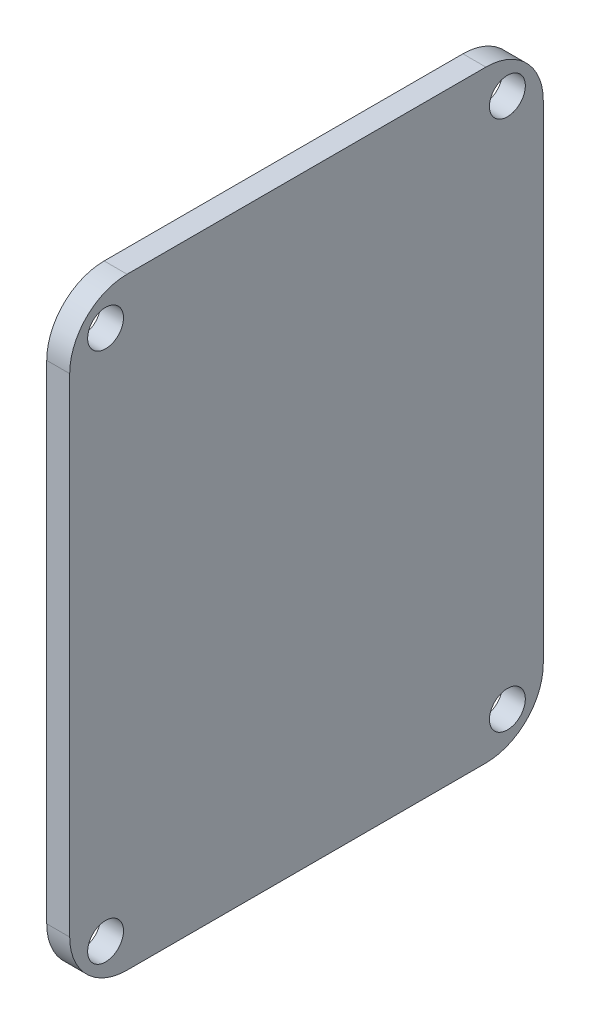
ISO-10303-21;
HEADER;
FILE_DESCRIPTION(('STEP AP214'),'2;1');
FILE_NAME('part.step','',(''),(''),'','','');
FILE_SCHEMA(('AUTOMOTIVE_DESIGN { 1 0 10303 214 1 1 1 1 }'));
ENDSEC;
DATA;
#1=APPLICATION_CONTEXT('core data for automotive mechanical design processes');
#2=APPLICATION_PROTOCOL_DEFINITION('international standard','automotive_design',2000,#1);
#3=PRODUCT_CONTEXT('',#1,'mechanical');
#4=PRODUCT('Part','Part','',(#3));
#5=PRODUCT_RELATED_PRODUCT_CATEGORY('part','',(#4));
#6=PRODUCT_DEFINITION_FORMATION('','',#4);
#7=PRODUCT_DEFINITION_CONTEXT('part definition',#1,'design');
#8=PRODUCT_DEFINITION('design','',#6,#7);
#9=PRODUCT_DEFINITION_SHAPE('','',#8);
#10=(LENGTH_UNIT() NAMED_UNIT(*) SI_UNIT(.MILLI.,.METRE.));
#11=(NAMED_UNIT(*) PLANE_ANGLE_UNIT() SI_UNIT($,.RADIAN.));
#12=(NAMED_UNIT(*) SI_UNIT($,.STERADIAN.) SOLID_ANGLE_UNIT());
#13=UNCERTAINTY_MEASURE_WITH_UNIT(LENGTH_MEASURE(1.E-05),#10,'distance_accuracy_value','');
#14=(GEOMETRIC_REPRESENTATION_CONTEXT(3) GLOBAL_UNCERTAINTY_ASSIGNED_CONTEXT((#13)) GLOBAL_UNIT_ASSIGNED_CONTEXT((#10,
#11,#12)) REPRESENTATION_CONTEXT('',''));
#15=CARTESIAN_POINT('',(0.,0.,0.));
#16=DIRECTION('',(0.,0.,1.));
#17=DIRECTION('',(1.,0.,0.));
#18=AXIS2_PLACEMENT_3D('',#15,#16,#17);
#19=CARTESIAN_POINT('',(1.6,-17.,-12.5));
#20=DIRECTION('',(-1.,0.,0.));
#21=DIRECTION('',(0.,0.,1.));
#22=AXIS2_PLACEMENT_3D('',#19,#20,#21);
#23=PLANE('',#22);
#24=CARTESIAN_POINT('',(1.6,-17.,-12.5));
#25=DIRECTION('',(1.,0.,0.));
#26=DIRECTION('',(0.,0.,1.));
#27=AXIS2_PLACEMENT_3D('',#24,#25,#26);
#28=CIRCLE('',#27,4.);
#29=CARTESIAN_POINT('',(1.6,-21.,-12.5));
#30=VERTEX_POINT('',#29);
#31=CARTESIAN_POINT('',(1.6,-17.,-16.5));
#32=VERTEX_POINT('',#31);
#33=EDGE_CURVE('E170',#30,#32,#28,.T.);
#34=ORIENTED_EDGE('',*,*,#33,.T.);
#35=DIRECTION('',(0.,1.,0.));
#36=VECTOR('',#35,1.);
#37=CARTESIAN_POINT('',(1.6,-17.,-16.5));
#38=LINE('',#37,#36);
#39=CARTESIAN_POINT('',(1.6,17.,-16.5));
#40=VERTEX_POINT('',#39);
#41=EDGE_CURVE('E106',#32,#40,#38,.T.);
#42=ORIENTED_EDGE('',*,*,#41,.T.);
#43=CARTESIAN_POINT('',(1.6,17.,-12.5));
#44=DIRECTION('',(1.,0.,0.));
#45=DIRECTION('',(0.,0.,-1.));
#46=AXIS2_PLACEMENT_3D('',#43,#44,#45);
#47=CIRCLE('',#46,4.);
#48=CARTESIAN_POINT('',(1.6,21.,-12.5));
#49=VERTEX_POINT('',#48);
#50=EDGE_CURVE('E191',#40,#49,#47,.T.);
#51=ORIENTED_EDGE('',*,*,#50,.T.);
#52=DIRECTION('',(0.,0.,1.));
#53=VECTOR('',#52,1.);
#54=CARTESIAN_POINT('',(1.6,21.,-12.5));
#55=LINE('',#54,#53);
#56=CARTESIAN_POINT('',(1.6,21.,12.5));
#57=VERTEX_POINT('',#56);
#58=EDGE_CURVE('E205',#49,#57,#55,.T.);
#59=ORIENTED_EDGE('',*,*,#58,.T.);
#60=CARTESIAN_POINT('',(1.6,17.,12.5));
#61=DIRECTION('',(1.,0.,0.));
#62=DIRECTION('',(0.,0.,1.));
#63=AXIS2_PLACEMENT_3D('',#60,#61,#62);
#64=CIRCLE('',#63,4.);
#65=CARTESIAN_POINT('',(1.6,17.,16.5));
#66=VERTEX_POINT('',#65);
#67=EDGE_CURVE('E125',#57,#66,#64,.T.);
#68=ORIENTED_EDGE('',*,*,#67,.T.);
#69=DIRECTION('',(0.,-1.,0.));
#70=VECTOR('',#69,1.);
#71=CARTESIAN_POINT('',(1.6,-17.,16.5));
#72=LINE('',#71,#70);
#73=CARTESIAN_POINT('',(1.6,-17.,16.5));
#74=VERTEX_POINT('',#73);
#75=EDGE_CURVE('E119',#66,#74,#72,.T.);
#76=ORIENTED_EDGE('',*,*,#75,.T.);
#77=CARTESIAN_POINT('',(1.6,-17.,12.5));
#78=DIRECTION('',(1.,0.,0.));
#79=DIRECTION('',(0.,0.,1.));
#80=AXIS2_PLACEMENT_3D('',#77,#78,#79);
#81=CIRCLE('',#80,4.);
#82=CARTESIAN_POINT('',(1.6,-21.,12.5));
#83=VERTEX_POINT('',#82);
#84=EDGE_CURVE('E123',#74,#83,#81,.T.);
#85=ORIENTED_EDGE('',*,*,#84,.T.);
#86=DIRECTION('',(0.,0.,-1.));
#87=VECTOR('',#86,1.);
#88=CARTESIAN_POINT('',(1.6,-21.,-12.5));
#89=LINE('',#88,#87);
#90=EDGE_CURVE('E63',#83,#30,#89,.T.);
#91=ORIENTED_EDGE('',*,*,#90,.T.);
#92=EDGE_LOOP('',(#34,#42,#51,#59,#68,#76,#85,#91));
#93=FACE_BOUND('',#92,.T.);
#94=CARTESIAN_POINT('',(1.6,-18.5,14.));
#95=DIRECTION('',(1.,0.,0.));
#96=DIRECTION('',(0.,0.,-1.));
#97=AXIS2_PLACEMENT_3D('',#94,#95,#96);
#98=CIRCLE('',#97,1.25);
#99=CARTESIAN_POINT('',(1.6,-18.5,12.75));
#100=VERTEX_POINT('',#99);
#101=EDGE_CURVE('E152',#100,#100,#98,.T.);
#102=ORIENTED_EDGE('',*,*,#101,.F.);
#103=EDGE_LOOP('',(#102));
#104=FACE_BOUND('',#103,.T.);
#105=CARTESIAN_POINT('',(1.6,18.5,14.));
#106=DIRECTION('',(1.,0.,0.));
#107=DIRECTION('',(0.,0.,-1.));
#108=AXIS2_PLACEMENT_3D('',#105,#106,#107);
#109=CIRCLE('',#108,1.25);
#110=CARTESIAN_POINT('',(1.6,18.5,12.75));
#111=VERTEX_POINT('',#110);
#112=EDGE_CURVE('E219',#111,#111,#109,.T.);
#113=ORIENTED_EDGE('',*,*,#112,.F.);
#114=EDGE_LOOP('',(#113));
#115=FACE_BOUND('',#114,.T.);
#116=CARTESIAN_POINT('',(1.6,-18.5,-14.));
#117=DIRECTION('',(1.,0.,0.));
#118=DIRECTION('',(0.,0.,-1.));
#119=AXIS2_PLACEMENT_3D('',#116,#117,#118);
#120=CIRCLE('',#119,1.25);
#121=CARTESIAN_POINT('',(1.6,-18.5,-15.25));
#122=VERTEX_POINT('',#121);
#123=EDGE_CURVE('E227',#122,#122,#120,.T.);
#124=ORIENTED_EDGE('',*,*,#123,.F.);
#125=EDGE_LOOP('',(#124));
#126=FACE_BOUND('',#125,.T.);
#127=CARTESIAN_POINT('',(1.6,18.5,-14.));
#128=DIRECTION('',(1.,0.,0.));
#129=DIRECTION('',(0.,0.,-1.));
#130=AXIS2_PLACEMENT_3D('',#127,#128,#129);
#131=CIRCLE('',#130,1.25);
#132=CARTESIAN_POINT('',(1.6,18.5,-15.25));
#133=VERTEX_POINT('',#132);
#134=EDGE_CURVE('E235',#133,#133,#131,.T.);
#135=ORIENTED_EDGE('',*,*,#134,.F.);
#136=EDGE_LOOP('',(#135));
#137=FACE_BOUND('',#136,.T.);
#138=ADVANCED_FACE('F45',(#93,#104,#115,#126,#137),#23,.F.);
#139=CARTESIAN_POINT('',(0.,-17.,-12.5));
#140=DIRECTION('',(-1.,0.,0.));
#141=DIRECTION('',(0.,0.,1.));
#142=AXIS2_PLACEMENT_3D('',#139,#140,#141);
#143=PLANE('',#142);
#144=CARTESIAN_POINT('',(0.,-18.5,-14.));
#145=DIRECTION('',(1.,0.,0.));
#146=DIRECTION('',(0.,0.,-1.));
#147=AXIS2_PLACEMENT_3D('',#144,#145,#146);
#148=CIRCLE('',#147,1.25);
#149=CARTESIAN_POINT('',(0.,-18.5,-15.25));
#150=VERTEX_POINT('',#149);
#151=EDGE_CURVE('E231',#150,#150,#148,.T.);
#152=ORIENTED_EDGE('',*,*,#151,.T.);
#153=EDGE_LOOP('',(#152));
#154=FACE_BOUND('',#153,.T.);
#155=CARTESIAN_POINT('',(0.,-18.5,14.));
#156=DIRECTION('',(1.,0.,0.));
#157=DIRECTION('',(0.,0.,-1.));
#158=AXIS2_PLACEMENT_3D('',#155,#156,#157);
#159=CIRCLE('',#158,1.25);
#160=CARTESIAN_POINT('',(0.,-18.5,12.75));
#161=VERTEX_POINT('',#160);
#162=EDGE_CURVE('E215',#161,#161,#159,.T.);
#163=ORIENTED_EDGE('',*,*,#162,.T.);
#164=EDGE_LOOP('',(#163));
#165=FACE_BOUND('',#164,.T.);
#166=CARTESIAN_POINT('',(0.,-17.,-12.5));
#167=DIRECTION('',(1.,0.,0.));
#168=DIRECTION('',(0.,0.,1.));
#169=AXIS2_PLACEMENT_3D('',#166,#167,#168);
#170=CIRCLE('',#169,4.);
#171=CARTESIAN_POINT('',(0.,-21.,-12.5));
#172=VERTEX_POINT('',#171);
#173=CARTESIAN_POINT('',(0.,-17.,-16.5));
#174=VERTEX_POINT('',#173);
#175=EDGE_CURVE('E147',#172,#174,#170,.T.);
#176=ORIENTED_EDGE('',*,*,#175,.F.);
#177=DIRECTION('',(0.,0.,-1.));
#178=VECTOR('',#177,1.);
#179=CARTESIAN_POINT('',(0.,-21.,-12.5));
#180=LINE('',#179,#178);
#181=CARTESIAN_POINT('',(0.,-21.,12.5));
#182=VERTEX_POINT('',#181);
#183=EDGE_CURVE('E98',#182,#172,#180,.T.);
#184=ORIENTED_EDGE('',*,*,#183,.F.);
#185=CARTESIAN_POINT('',(0.,-17.,12.5));
#186=DIRECTION('',(1.,0.,0.));
#187=DIRECTION('',(0.,0.,1.));
#188=AXIS2_PLACEMENT_3D('',#185,#186,#187);
#189=CIRCLE('',#188,4.);
#190=CARTESIAN_POINT('',(0.,-17.,16.5));
#191=VERTEX_POINT('',#190);
#192=EDGE_CURVE('E92',#191,#182,#189,.T.);
#193=ORIENTED_EDGE('',*,*,#192,.F.);
#194=DIRECTION('',(0.,-1.,0.));
#195=VECTOR('',#194,1.);
#196=CARTESIAN_POINT('',(0.,-17.,16.5));
#197=LINE('',#196,#195);
#198=CARTESIAN_POINT('',(0.,17.,16.5));
#199=VERTEX_POINT('',#198);
#200=EDGE_CURVE('E134',#199,#191,#197,.T.);
#201=ORIENTED_EDGE('',*,*,#200,.F.);
#202=CARTESIAN_POINT('',(0.,17.,12.5));
#203=DIRECTION('',(1.,0.,0.));
#204=DIRECTION('',(0.,0.,1.));
#205=AXIS2_PLACEMENT_3D('',#202,#203,#204);
#206=CIRCLE('',#205,4.);
#207=CARTESIAN_POINT('',(0.,21.,12.5));
#208=VERTEX_POINT('',#207);
#209=EDGE_CURVE('E161',#208,#199,#206,.T.);
#210=ORIENTED_EDGE('',*,*,#209,.F.);
#211=DIRECTION('',(0.,0.,1.));
#212=VECTOR('',#211,1.);
#213=CARTESIAN_POINT('',(0.,21.,-12.5));
#214=LINE('',#213,#212);
#215=CARTESIAN_POINT('',(0.,21.,-12.5));
#216=VERTEX_POINT('',#215);
#217=EDGE_CURVE('E158',#216,#208,#214,.T.);
#218=ORIENTED_EDGE('',*,*,#217,.F.);
#219=CARTESIAN_POINT('',(0.,17.,-12.5));
#220=DIRECTION('',(1.,0.,0.));
#221=DIRECTION('',(0.,0.,-1.));
#222=AXIS2_PLACEMENT_3D('',#219,#220,#221);
#223=CIRCLE('',#222,4.);
#224=CARTESIAN_POINT('',(0.,17.,-16.5));
#225=VERTEX_POINT('',#224);
#226=EDGE_CURVE('E155',#225,#216,#223,.T.);
#227=ORIENTED_EDGE('',*,*,#226,.F.);
#228=DIRECTION('',(0.,1.,0.));
#229=VECTOR('',#228,1.);
#230=CARTESIAN_POINT('',(0.,-17.,-16.5));
#231=LINE('',#230,#229);
#232=EDGE_CURVE('E151',#174,#225,#231,.T.);
#233=ORIENTED_EDGE('',*,*,#232,.F.);
#234=EDGE_LOOP('',(#176,#184,#193,#201,#210,#218,#227,#233));
#235=FACE_BOUND('',#234,.T.);
#236=CARTESIAN_POINT('',(0.,18.5,14.));
#237=DIRECTION('',(1.,0.,0.));
#238=DIRECTION('',(0.,0.,-1.));
#239=AXIS2_PLACEMENT_3D('',#236,#237,#238);
#240=CIRCLE('',#239,1.25);
#241=CARTESIAN_POINT('',(0.,18.5,12.75));
#242=VERTEX_POINT('',#241);
#243=EDGE_CURVE('E223',#242,#242,#240,.T.);
#244=ORIENTED_EDGE('',*,*,#243,.T.);
#245=EDGE_LOOP('',(#244));
#246=FACE_BOUND('',#245,.T.);
#247=CARTESIAN_POINT('',(0.,18.5,-14.));
#248=DIRECTION('',(1.,0.,0.));
#249=DIRECTION('',(0.,0.,-1.));
#250=AXIS2_PLACEMENT_3D('',#247,#248,#249);
#251=CIRCLE('',#250,1.25);
#252=CARTESIAN_POINT('',(0.,18.5,-15.25));
#253=VERTEX_POINT('',#252);
#254=EDGE_CURVE('E239',#253,#253,#251,.T.);
#255=ORIENTED_EDGE('',*,*,#254,.T.);
#256=EDGE_LOOP('',(#255));
#257=FACE_BOUND('',#256,.T.);
#258=ADVANCED_FACE('F195',(#154,#165,#235,#246,#257),#143,.T.);
#259=CARTESIAN_POINT('',(1.6,-17.,-12.5));
#260=DIRECTION('',(-1.,0.,0.));
#261=DIRECTION('',(0.,0.,1.));
#262=AXIS2_PLACEMENT_3D('',#259,#260,#261);
#263=CYLINDRICAL_SURFACE('',#262,4.);
#264=ORIENTED_EDGE('',*,*,#175,.T.);
#265=DIRECTION('',(-1.,0.,0.));
#266=VECTOR('',#265,1.);
#267=CARTESIAN_POINT('',(1.6,-17.,-16.5));
#268=LINE('',#267,#266);
#269=EDGE_CURVE('E11',#32,#174,#268,.T.);
#270=ORIENTED_EDGE('',*,*,#269,.F.);
#271=ORIENTED_EDGE('',*,*,#33,.F.);
#272=DIRECTION('',(-1.,0.,0.));
#273=VECTOR('',#272,1.);
#274=CARTESIAN_POINT('',(1.6,-21.,-12.5));
#275=LINE('',#274,#273);
#276=EDGE_CURVE('E143',#30,#172,#275,.T.);
#277=ORIENTED_EDGE('',*,*,#276,.T.);
#278=EDGE_LOOP('',(#264,#270,#271,#277));
#279=FACE_BOUND('',#278,.T.);
#280=ADVANCED_FACE('F47',(#279),#263,.T.);
#281=CARTESIAN_POINT('',(1.6,-17.,-16.5));
#282=DIRECTION('',(0.,0.,1.));
#283=DIRECTION('',(0.,-1.,0.));
#284=AXIS2_PLACEMENT_3D('',#281,#282,#283);
#285=PLANE('',#284);
#286=ORIENTED_EDGE('',*,*,#232,.T.);
#287=DIRECTION('',(-1.,0.,0.));
#288=VECTOR('',#287,1.);
#289=CARTESIAN_POINT('',(1.6,17.,-16.5));
#290=LINE('',#289,#288);
#291=EDGE_CURVE('E55',#40,#225,#290,.T.);
#292=ORIENTED_EDGE('',*,*,#291,.F.);
#293=ORIENTED_EDGE('',*,*,#41,.F.);
#294=ORIENTED_EDGE('',*,*,#269,.T.);
#295=EDGE_LOOP('',(#286,#292,#293,#294));
#296=FACE_BOUND('',#295,.T.);
#297=ADVANCED_FACE('F273',(#296),#285,.F.);
#298=CARTESIAN_POINT('',(1.6,17.,-12.5));
#299=DIRECTION('',(-1.,0.,0.));
#300=DIRECTION('',(0.,0.,1.));
#301=AXIS2_PLACEMENT_3D('',#298,#299,#300);
#302=CYLINDRICAL_SURFACE('',#301,4.);
#303=ORIENTED_EDGE('',*,*,#226,.T.);
#304=DIRECTION('',(-1.,0.,0.));
#305=VECTOR('',#304,1.);
#306=CARTESIAN_POINT('',(1.6,21.,-12.5));
#307=LINE('',#306,#305);
#308=EDGE_CURVE('E181',#49,#216,#307,.T.);
#309=ORIENTED_EDGE('',*,*,#308,.F.);
#310=ORIENTED_EDGE('',*,*,#50,.F.);
#311=ORIENTED_EDGE('',*,*,#291,.T.);
#312=EDGE_LOOP('',(#303,#309,#310,#311));
#313=FACE_BOUND('',#312,.T.);
#314=ADVANCED_FACE('F189',(#313),#302,.T.);
#315=CARTESIAN_POINT('',(1.6,21.,-12.5));
#316=DIRECTION('',(0.,-1.,0.));
#317=DIRECTION('',(0.,0.,-1.));
#318=AXIS2_PLACEMENT_3D('',#315,#316,#317);
#319=PLANE('',#318);
#320=ORIENTED_EDGE('',*,*,#217,.T.);
#321=DIRECTION('',(-1.,0.,0.));
#322=VECTOR('',#321,1.);
#323=CARTESIAN_POINT('',(1.6,21.,12.5));
#324=LINE('',#323,#322);
#325=EDGE_CURVE('E177',#57,#208,#324,.T.);
#326=ORIENTED_EDGE('',*,*,#325,.F.);
#327=ORIENTED_EDGE('',*,*,#58,.F.);
#328=ORIENTED_EDGE('',*,*,#308,.T.);
#329=EDGE_LOOP('',(#320,#326,#327,#328));
#330=FACE_BOUND('',#329,.T.);
#331=ADVANCED_FACE('F200',(#330),#319,.F.);
#332=CARTESIAN_POINT('',(1.6,17.,12.5));
#333=DIRECTION('',(-1.,0.,0.));
#334=DIRECTION('',(0.,0.,1.));
#335=AXIS2_PLACEMENT_3D('',#332,#333,#334);
#336=CYLINDRICAL_SURFACE('',#335,4.);
#337=ORIENTED_EDGE('',*,*,#209,.T.);
#338=DIRECTION('',(-1.,0.,0.));
#339=VECTOR('',#338,1.);
#340=CARTESIAN_POINT('',(1.6,17.,16.5));
#341=LINE('',#340,#339);
#342=EDGE_CURVE('E136',#66,#199,#341,.T.);
#343=ORIENTED_EDGE('',*,*,#342,.F.);
#344=ORIENTED_EDGE('',*,*,#67,.F.);
#345=ORIENTED_EDGE('',*,*,#325,.T.);
#346=EDGE_LOOP('',(#337,#343,#344,#345));
#347=FACE_BOUND('',#346,.T.);
#348=ADVANCED_FACE('F203',(#347),#336,.T.);
#349=CARTESIAN_POINT('',(1.6,-17.,16.5));
#350=DIRECTION('',(0.,0.,-1.));
#351=DIRECTION('',(0.,1.,0.));
#352=AXIS2_PLACEMENT_3D('',#349,#350,#351);
#353=PLANE('',#352);
#354=ORIENTED_EDGE('',*,*,#200,.T.);
#355=DIRECTION('',(-1.,0.,0.));
#356=VECTOR('',#355,1.);
#357=CARTESIAN_POINT('',(1.6,-17.,16.5));
#358=LINE('',#357,#356);
#359=EDGE_CURVE('E131',#74,#191,#358,.T.);
#360=ORIENTED_EDGE('',*,*,#359,.F.);
#361=ORIENTED_EDGE('',*,*,#75,.F.);
#362=ORIENTED_EDGE('',*,*,#342,.T.);
#363=EDGE_LOOP('',(#354,#360,#361,#362));
#364=FACE_BOUND('',#363,.T.);
#365=ADVANCED_FACE('F132',(#364),#353,.F.);
#366=CARTESIAN_POINT('',(1.6,-17.,12.5));
#367=DIRECTION('',(-1.,0.,0.));
#368=DIRECTION('',(0.,0.,1.));
#369=AXIS2_PLACEMENT_3D('',#366,#367,#368);
#370=CYLINDRICAL_SURFACE('',#369,4.);
#371=ORIENTED_EDGE('',*,*,#192,.T.);
#372=DIRECTION('',(-1.,0.,0.));
#373=VECTOR('',#372,1.);
#374=CARTESIAN_POINT('',(1.6,-21.,12.5));
#375=LINE('',#374,#373);
#376=EDGE_CURVE('E137',#83,#182,#375,.T.);
#377=ORIENTED_EDGE('',*,*,#376,.F.);
#378=ORIENTED_EDGE('',*,*,#84,.F.);
#379=ORIENTED_EDGE('',*,*,#359,.T.);
#380=EDGE_LOOP('',(#371,#377,#378,#379));
#381=FACE_BOUND('',#380,.T.);
#382=ADVANCED_FACE('F139',(#381),#370,.T.);
#383=CARTESIAN_POINT('',(1.6,-21.,-12.5));
#384=DIRECTION('',(0.,1.,0.));
#385=DIRECTION('',(0.,0.,1.));
#386=AXIS2_PLACEMENT_3D('',#383,#384,#385);
#387=PLANE('',#386);
#388=ORIENTED_EDGE('',*,*,#183,.T.);
#389=ORIENTED_EDGE('',*,*,#276,.F.);
#390=ORIENTED_EDGE('',*,*,#90,.F.);
#391=ORIENTED_EDGE('',*,*,#376,.T.);
#392=EDGE_LOOP('',(#388,#389,#390,#391));
#393=FACE_BOUND('',#392,.T.);
#394=ADVANCED_FACE('F261',(#393),#387,.F.);
#395=CARTESIAN_POINT('',(1.6,-18.5,14.));
#396=DIRECTION('',(-1.,0.,0.));
#397=DIRECTION('',(0.,0.,1.));
#398=AXIS2_PLACEMENT_3D('',#395,#396,#397);
#399=CYLINDRICAL_SURFACE('',#398,1.25);
#400=ORIENTED_EDGE('',*,*,#101,.T.);
#401=EDGE_LOOP('',(#400));
#402=FACE_BOUND('',#401,.T.);
#403=ORIENTED_EDGE('',*,*,#162,.F.);
#404=EDGE_LOOP('',(#403));
#405=FACE_BOUND('',#404,.T.);
#406=ADVANCED_FACE('F258',(#402,#405),#399,.F.);
#407=CARTESIAN_POINT('',(1.6,18.5,14.));
#408=DIRECTION('',(-1.,0.,0.));
#409=DIRECTION('',(0.,0.,1.));
#410=AXIS2_PLACEMENT_3D('',#407,#408,#409);
#411=CYLINDRICAL_SURFACE('',#410,1.25);
#412=ORIENTED_EDGE('',*,*,#112,.T.);
#413=EDGE_LOOP('',(#412));
#414=FACE_BOUND('',#413,.T.);
#415=ORIENTED_EDGE('',*,*,#243,.F.);
#416=EDGE_LOOP('',(#415));
#417=FACE_BOUND('',#416,.T.);
#418=ADVANCED_FACE('F336',(#414,#417),#411,.F.);
#419=CARTESIAN_POINT('',(1.6,-18.5,-14.));
#420=DIRECTION('',(-1.,0.,0.));
#421=DIRECTION('',(0.,0.,1.));
#422=AXIS2_PLACEMENT_3D('',#419,#420,#421);
#423=CYLINDRICAL_SURFACE('',#422,1.25);
#424=ORIENTED_EDGE('',*,*,#123,.T.);
#425=EDGE_LOOP('',(#424));
#426=FACE_BOUND('',#425,.T.);
#427=ORIENTED_EDGE('',*,*,#151,.F.);
#428=EDGE_LOOP('',(#427));
#429=FACE_BOUND('',#428,.T.);
#430=ADVANCED_FACE('F344',(#426,#429),#423,.F.);
#431=CARTESIAN_POINT('',(1.6,18.5,-14.));
#432=DIRECTION('',(-1.,0.,0.));
#433=DIRECTION('',(0.,0.,1.));
#434=AXIS2_PLACEMENT_3D('',#431,#432,#433);
#435=CYLINDRICAL_SURFACE('',#434,1.25);
#436=ORIENTED_EDGE('',*,*,#134,.T.);
#437=EDGE_LOOP('',(#436));
#438=FACE_BOUND('',#437,.T.);
#439=ORIENTED_EDGE('',*,*,#254,.F.);
#440=EDGE_LOOP('',(#439));
#441=FACE_BOUND('',#440,.T.);
#442=ADVANCED_FACE('F247',(#438,#441),#435,.F.);
#443=CLOSED_SHELL('',(#138,#258,#280,#297,#314,#331,#348,#365,#382,#394,#406,#418,#430,#442));
#444=MANIFOLD_SOLID_BREP('B2',#443);
#445=ADVANCED_BREP_SHAPE_REPRESENTATION('',(#18,#444),#14);
#446=SHAPE_DEFINITION_REPRESENTATION(#9,#445);
ENDSEC;
END-ISO-10303-21;
